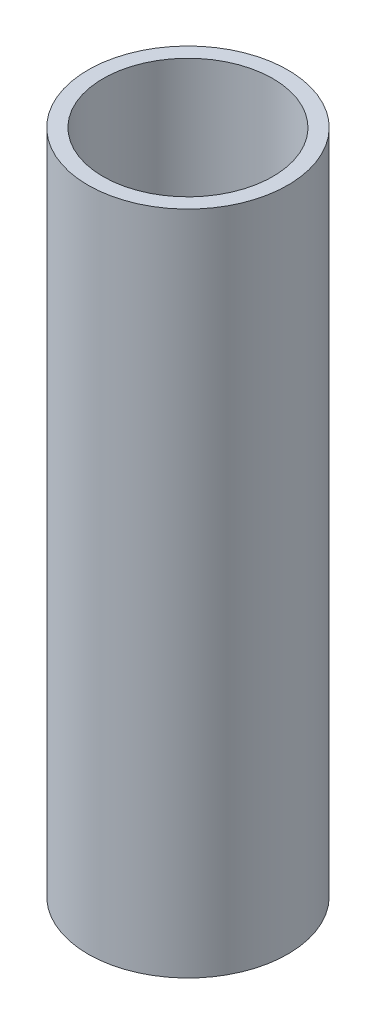
ISO-10303-21;
HEADER;
FILE_DESCRIPTION(('STEP AP214'),'2;1');
FILE_NAME('part.step','',(''),(''),'','','');
FILE_SCHEMA(('AUTOMOTIVE_DESIGN { 1 0 10303 214 1 1 1 1 }'));
ENDSEC;
DATA;
#1=APPLICATION_CONTEXT('core data for automotive mechanical design processes');
#2=APPLICATION_PROTOCOL_DEFINITION('international standard','automotive_design',2000,#1);
#3=PRODUCT_CONTEXT('',#1,'mechanical');
#4=PRODUCT('Part','Part','',(#3));
#5=PRODUCT_RELATED_PRODUCT_CATEGORY('part','',(#4));
#6=PRODUCT_DEFINITION_FORMATION('','',#4);
#7=PRODUCT_DEFINITION_CONTEXT('part definition',#1,'design');
#8=PRODUCT_DEFINITION('design','',#6,#7);
#9=PRODUCT_DEFINITION_SHAPE('','',#8);
#10=(LENGTH_UNIT() NAMED_UNIT(*) SI_UNIT(.MILLI.,.METRE.));
#11=(NAMED_UNIT(*) PLANE_ANGLE_UNIT() SI_UNIT($,.RADIAN.));
#12=(NAMED_UNIT(*) SI_UNIT($,.STERADIAN.) SOLID_ANGLE_UNIT());
#13=UNCERTAINTY_MEASURE_WITH_UNIT(LENGTH_MEASURE(1.E-05),#10,'distance_accuracy_value','');
#14=(GEOMETRIC_REPRESENTATION_CONTEXT(3) GLOBAL_UNCERTAINTY_ASSIGNED_CONTEXT((#13)) GLOBAL_UNIT_ASSIGNED_CONTEXT((#10,
#11,#12)) REPRESENTATION_CONTEXT('',''));
#15=CARTESIAN_POINT('',(0.,0.,0.));
#16=DIRECTION('',(0.,0.,1.));
#17=DIRECTION('',(1.,0.,0.));
#18=AXIS2_PLACEMENT_3D('',#15,#16,#17);
#19=CARTESIAN_POINT('',(0.,200.,0.));
#20=DIRECTION('',(0.,1.,0.));
#21=DIRECTION('',(0.,0.,1.));
#22=AXIS2_PLACEMENT_3D('',#19,#20,#21);
#23=PLANE('',#22);
#24=CARTESIAN_POINT('',(0.,200.,0.));
#25=DIRECTION('',(0.,1.,0.));
#26=DIRECTION('',(0.,0.,1.));
#27=AXIS2_PLACEMENT_3D('',#24,#25,#26);
#28=CIRCLE('',#27,30.);
#29=CARTESIAN_POINT('',(0.,200.,30.));
#30=VERTEX_POINT('',#29);
#31=EDGE_CURVE('E10',#30,#30,#28,.T.);
#32=ORIENTED_EDGE('',*,*,#31,.T.);
#33=EDGE_LOOP('',(#32));
#34=FACE_BOUND('',#33,.T.);
#35=CARTESIAN_POINT('',(0.,200.,0.));
#36=DIRECTION('',(0.,1.,0.));
#37=DIRECTION('',(0.,0.,1.));
#38=AXIS2_PLACEMENT_3D('',#35,#36,#37);
#39=CIRCLE('',#38,25.5);
#40=CARTESIAN_POINT('',(0.,200.,25.5));
#41=VERTEX_POINT('',#40);
#42=EDGE_CURVE('E46',#41,#41,#39,.T.);
#43=ORIENTED_EDGE('',*,*,#42,.F.);
#44=EDGE_LOOP('',(#43));
#45=FACE_BOUND('',#44,.T.);
#46=ADVANCED_FACE('F35',(#34,#45),#23,.T.);
#47=CARTESIAN_POINT('',(0.,0.,0.));
#48=DIRECTION('',(0.,1.,0.));
#49=DIRECTION('',(0.,0.,1.));
#50=AXIS2_PLACEMENT_3D('',#47,#48,#49);
#51=PLANE('',#50);
#52=CARTESIAN_POINT('',(0.,0.,0.));
#53=DIRECTION('',(0.,1.,0.));
#54=DIRECTION('',(0.,0.,1.));
#55=AXIS2_PLACEMENT_3D('',#52,#53,#54);
#56=CIRCLE('',#55,30.);
#57=CARTESIAN_POINT('',(0.,0.,30.));
#58=VERTEX_POINT('',#57);
#59=EDGE_CURVE('E39',#58,#58,#56,.T.);
#60=ORIENTED_EDGE('',*,*,#59,.F.);
#61=EDGE_LOOP('',(#60));
#62=FACE_BOUND('',#61,.T.);
#63=CARTESIAN_POINT('',(0.,0.,0.));
#64=DIRECTION('',(0.,1.,0.));
#65=DIRECTION('',(0.,0.,1.));
#66=AXIS2_PLACEMENT_3D('',#63,#64,#65);
#67=CIRCLE('',#66,25.5);
#68=CARTESIAN_POINT('',(0.,0.,25.5));
#69=VERTEX_POINT('',#68);
#70=EDGE_CURVE('E48',#69,#69,#67,.T.);
#71=ORIENTED_EDGE('',*,*,#70,.T.);
#72=EDGE_LOOP('',(#71));
#73=FACE_BOUND('',#72,.T.);
#74=ADVANCED_FACE('F58',(#62,#73),#51,.F.);
#75=CARTESIAN_POINT('',(0.,200.,0.));
#76=DIRECTION('',(0.,-1.,0.));
#77=DIRECTION('',(0.,0.,-1.));
#78=AXIS2_PLACEMENT_3D('',#75,#76,#77);
#79=CYLINDRICAL_SURFACE('',#78,30.);
#80=ORIENTED_EDGE('',*,*,#31,.F.);
#81=EDGE_LOOP('',(#80));
#82=FACE_BOUND('',#81,.T.);
#83=ORIENTED_EDGE('',*,*,#59,.T.);
#84=EDGE_LOOP('',(#83));
#85=FACE_BOUND('',#84,.T.);
#86=ADVANCED_FACE('F37',(#82,#85),#79,.T.);
#87=CARTESIAN_POINT('',(0.,200.,0.));
#88=DIRECTION('',(0.,-1.,0.));
#89=DIRECTION('',(0.,0.,-1.));
#90=AXIS2_PLACEMENT_3D('',#87,#88,#89);
#91=CYLINDRICAL_SURFACE('',#90,25.5);
#92=ORIENTED_EDGE('',*,*,#42,.T.);
#93=EDGE_LOOP('',(#92));
#94=FACE_BOUND('',#93,.T.);
#95=ORIENTED_EDGE('',*,*,#70,.F.);
#96=EDGE_LOOP('',(#95));
#97=FACE_BOUND('',#96,.T.);
#98=ADVANCED_FACE('F54',(#94,#97),#91,.F.);
#99=CLOSED_SHELL('',(#46,#74,#86,#98));
#100=MANIFOLD_SOLID_BREP('B2',#99);
#101=ADVANCED_BREP_SHAPE_REPRESENTATION('',(#18,#100),#14);
#102=SHAPE_DEFINITION_REPRESENTATION(#9,#101);
ENDSEC;
END-ISO-10303-21;
